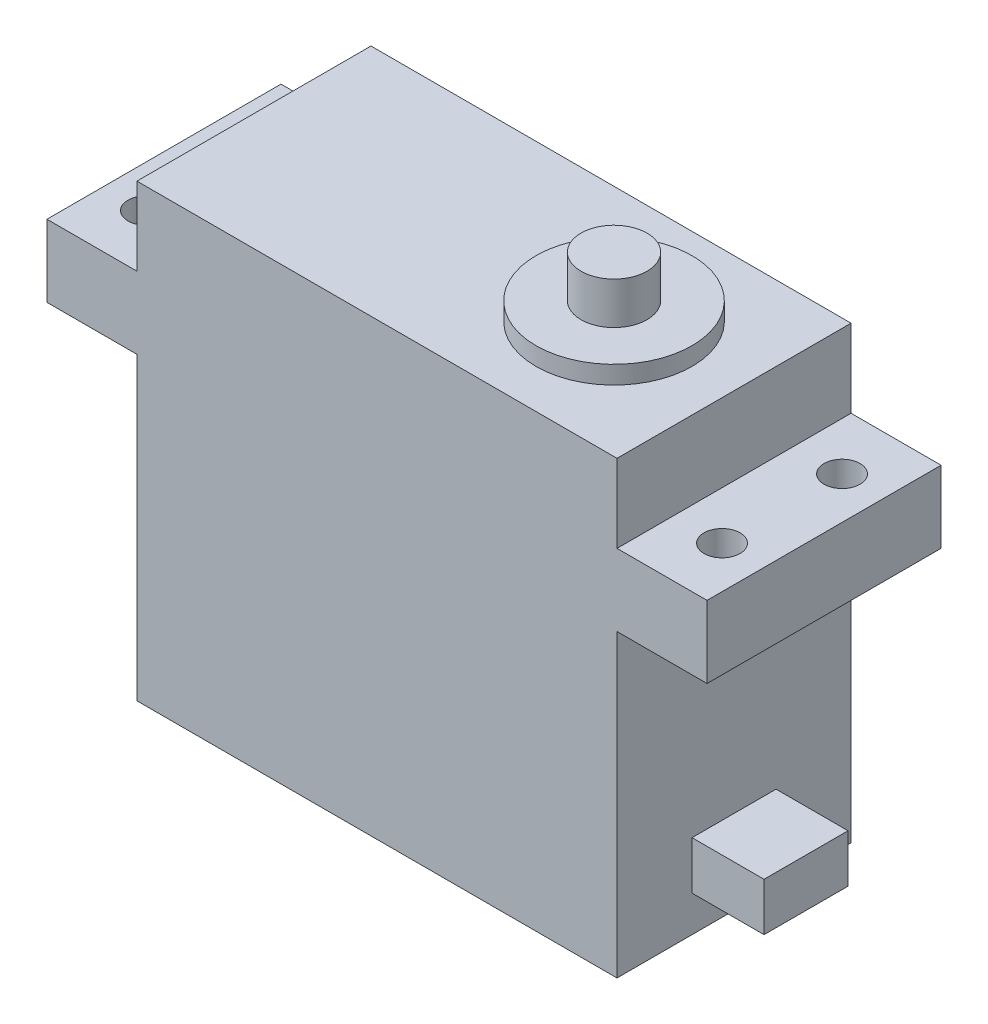
ISO-10303-21;
HEADER;
FILE_DESCRIPTION(('STEP AP214'),'2;1');
FILE_NAME('part.step','',(''),(''),'','','');
FILE_SCHEMA(('AUTOMOTIVE_DESIGN { 1 0 10303 214 1 1 1 1 }'));
ENDSEC;
DATA;
#1=APPLICATION_CONTEXT('core data for automotive mechanical design processes');
#2=APPLICATION_PROTOCOL_DEFINITION('international standard','automotive_design',2000,#1);
#3=PRODUCT_CONTEXT('',#1,'mechanical');
#4=PRODUCT('Part','Part','',(#3));
#5=PRODUCT_RELATED_PRODUCT_CATEGORY('part','',(#4));
#6=PRODUCT_DEFINITION_FORMATION('','',#4);
#7=PRODUCT_DEFINITION_CONTEXT('part definition',#1,'design');
#8=PRODUCT_DEFINITION('design','',#6,#7);
#9=PRODUCT_DEFINITION_SHAPE('','',#8);
#10=(LENGTH_UNIT() NAMED_UNIT(*) SI_UNIT(.MILLI.,.METRE.));
#11=(NAMED_UNIT(*) PLANE_ANGLE_UNIT() SI_UNIT($,.RADIAN.));
#12=(NAMED_UNIT(*) SI_UNIT($,.STERADIAN.) SOLID_ANGLE_UNIT());
#13=UNCERTAINTY_MEASURE_WITH_UNIT(LENGTH_MEASURE(1.E-05),#10,'distance_accuracy_value','');
#14=(GEOMETRIC_REPRESENTATION_CONTEXT(3) GLOBAL_UNCERTAINTY_ASSIGNED_CONTEXT((#13)) GLOBAL_UNIT_ASSIGNED_CONTEXT((#10,
#11,#12)) REPRESENTATION_CONTEXT('',''));
#15=CARTESIAN_POINT('',(0.,0.,0.));
#16=DIRECTION('',(0.,0.,1.));
#17=DIRECTION('',(1.,0.,0.));
#18=AXIS2_PLACEMENT_3D('',#15,#16,#17);
#19=CARTESIAN_POINT('',(10.,37.5,-9.75));
#20=DIRECTION('',(-1.,0.,0.));
#21=DIRECTION('',(0.,0.,1.));
#22=AXIS2_PLACEMENT_3D('',#19,#20,#21);
#23=PLANE('',#22);
#24=DIRECTION('',(0.,-1.,0.));
#25=VECTOR('',#24,1.);
#26=CARTESIAN_POINT('',(10.,37.5,-9.75));
#27=LINE('',#26,#25);
#28=CARTESIAN_POINT('',(10.,25.,-9.75));
#29=VERTEX_POINT('',#28);
#30=CARTESIAN_POINT('',(10.,0.,-9.75));
#31=VERTEX_POINT('',#30);
#32=EDGE_CURVE('E279',#29,#31,#27,.T.);
#33=ORIENTED_EDGE('',*,*,#32,.F.);
#34=DIRECTION('',(0.,0.,1.));
#35=VECTOR('',#34,1.);
#36=CARTESIAN_POINT('',(10.,25.,-9.75));
#37=LINE('',#36,#35);
#38=CARTESIAN_POINT('',(10.,25.,9.74999999999998));
#39=VERTEX_POINT('',#38);
#40=EDGE_CURVE('E232',#29,#39,#37,.T.);
#41=ORIENTED_EDGE('',*,*,#40,.T.);
#42=DIRECTION('',(0.,-1.,0.));
#43=VECTOR('',#42,1.);
#44=CARTESIAN_POINT('',(10.,37.5,9.75));
#45=LINE('',#44,#43);
#46=CARTESIAN_POINT('',(10.,0.,9.75));
#47=VERTEX_POINT('',#46);
#48=EDGE_CURVE('E282',#39,#47,#45,.T.);
#49=ORIENTED_EDGE('',*,*,#48,.T.);
#50=DIRECTION('',(0.,0.,-1.));
#51=VECTOR('',#50,1.);
#52=CARTESIAN_POINT('',(10.,0.,-9.75));
#53=LINE('',#52,#51);
#54=EDGE_CURVE('E272',#47,#31,#53,.T.);
#55=ORIENTED_EDGE('',*,*,#54,.T.);
#56=EDGE_LOOP('',(#33,#41,#49,#55));
#57=FACE_BOUND('',#56,.T.);
#58=DIRECTION('',(0.,-1.,0.));
#59=VECTOR('',#58,1.);
#60=CARTESIAN_POINT('',(10.,7.,3.5));
#61=LINE('',#60,#59);
#62=CARTESIAN_POINT('',(10.,7.,3.5));
#63=VERTEX_POINT('',#62);
#64=CARTESIAN_POINT('',(10.,3.00000000000001,3.5));
#65=VERTEX_POINT('',#64);
#66=EDGE_CURVE('E166',#63,#65,#61,.T.);
#67=ORIENTED_EDGE('',*,*,#66,.F.);
#68=DIRECTION('',(0.,0.,1.));
#69=VECTOR('',#68,1.);
#70=CARTESIAN_POINT('',(10.,7.,3.5));
#71=LINE('',#70,#69);
#72=CARTESIAN_POINT('',(10.,7.,-3.5));
#73=VERTEX_POINT('',#72);
#74=EDGE_CURVE('E163',#73,#63,#71,.T.);
#75=ORIENTED_EDGE('',*,*,#74,.F.);
#76=DIRECTION('',(0.,1.,0.));
#77=VECTOR('',#76,1.);
#78=CARTESIAN_POINT('',(10.,7.,-3.5));
#79=LINE('',#78,#77);
#80=CARTESIAN_POINT('',(10.,3.,-3.5));
#81=VERTEX_POINT('',#80);
#82=EDGE_CURVE('E53',#81,#73,#79,.T.);
#83=ORIENTED_EDGE('',*,*,#82,.F.);
#84=DIRECTION('',(0.,0.,-1.));
#85=VECTOR('',#84,1.);
#86=CARTESIAN_POINT('',(10.,3.,3.5));
#87=LINE('',#86,#85);
#88=EDGE_CURVE('E48',#65,#81,#87,.T.);
#89=ORIENTED_EDGE('',*,*,#88,.F.);
#90=EDGE_LOOP('',(#67,#75,#83,#89));
#91=FACE_BOUND('',#90,.T.);
#92=ADVANCED_FACE('F33',(#57,#91),#23,.F.);
#93=CARTESIAN_POINT('',(-30.,37.5,-9.75));
#94=DIRECTION('',(1.,0.,0.));
#95=DIRECTION('',(0.,0.,-1.));
#96=AXIS2_PLACEMENT_3D('',#93,#94,#95);
#97=PLANE('',#96);
#98=DIRECTION('',(0.,0.,-1.));
#99=VECTOR('',#98,1.);
#100=CARTESIAN_POINT('',(-30.,31.,-9.75));
#101=LINE('',#100,#99);
#102=CARTESIAN_POINT('',(-30.,31.,9.75));
#103=VERTEX_POINT('',#102);
#104=CARTESIAN_POINT('',(-30.,31.,-9.75));
#105=VERTEX_POINT('',#104);
#106=EDGE_CURVE('E240',#103,#105,#101,.T.);
#107=ORIENTED_EDGE('',*,*,#106,.F.);
#108=DIRECTION('',(0.,-1.,0.));
#109=VECTOR('',#108,1.);
#110=CARTESIAN_POINT('',(-30.,37.5,9.75));
#111=LINE('',#110,#109);
#112=CARTESIAN_POINT('',(-30.,37.5,9.75));
#113=VERTEX_POINT('',#112);
#114=EDGE_CURVE('E11',#113,#103,#111,.T.);
#115=ORIENTED_EDGE('',*,*,#114,.F.);
#116=DIRECTION('',(0.,0.,1.));
#117=VECTOR('',#116,1.);
#118=CARTESIAN_POINT('',(-30.,37.5,-9.75));
#119=LINE('',#118,#117);
#120=CARTESIAN_POINT('',(-30.,37.5,-9.75));
#121=VERTEX_POINT('',#120);
#122=EDGE_CURVE('E256',#121,#113,#119,.T.);
#123=ORIENTED_EDGE('',*,*,#122,.F.);
#124=DIRECTION('',(0.,-1.,0.));
#125=VECTOR('',#124,1.);
#126=CARTESIAN_POINT('',(-30.,37.5,-9.75));
#127=LINE('',#126,#125);
#128=EDGE_CURVE('E277',#121,#105,#127,.T.);
#129=ORIENTED_EDGE('',*,*,#128,.T.);
#130=EDGE_LOOP('',(#107,#115,#123,#129));
#131=FACE_BOUND('',#130,.T.);
#132=ADVANCED_FACE('F326',(#131),#97,.F.);
#133=DIRECTION('',(0.,0.,1.));
#134=VECTOR('',#133,1.);
#135=CARTESIAN_POINT('',(10.,31.,-9.75));
#136=LINE('',#135,#134);
#137=CARTESIAN_POINT('',(10.,31.,-9.75000000000002));
#138=VERTEX_POINT('',#137);
#139=CARTESIAN_POINT('',(10.,31.,9.74999999999998));
#140=VERTEX_POINT('',#139);
#141=EDGE_CURVE('E238',#138,#140,#136,.T.);
#142=ORIENTED_EDGE('',*,*,#141,.F.);
#143=CARTESIAN_POINT('',(10.,37.5,-9.75));
#144=VERTEX_POINT('',#143);
#145=EDGE_CURVE('E280',#144,#138,#27,.T.);
#146=ORIENTED_EDGE('',*,*,#145,.F.);
#147=DIRECTION('',(0.,0.,-1.));
#148=VECTOR('',#147,1.);
#149=CARTESIAN_POINT('',(10.,37.5,-9.75));
#150=LINE('',#149,#148);
#151=CARTESIAN_POINT('',(10.,37.5,9.75));
#152=VERTEX_POINT('',#151);
#153=EDGE_CURVE('E262',#152,#144,#150,.T.);
#154=ORIENTED_EDGE('',*,*,#153,.F.);
#155=EDGE_CURVE('E283',#152,#140,#45,.T.);
#156=ORIENTED_EDGE('',*,*,#155,.T.);
#157=EDGE_LOOP('',(#142,#146,#154,#156));
#158=FACE_BOUND('',#157,.T.);
#159=ADVANCED_FACE('F317',(#158),#23,.F.);
#160=CARTESIAN_POINT('',(0.,39.,0.));
#161=DIRECTION('',(0.,1.,0.));
#162=DIRECTION('',(0.,0.,1.));
#163=AXIS2_PLACEMENT_3D('',#160,#161,#162);
#164=PLANE('',#163);
#165=CARTESIAN_POINT('',(0.,39.,0.));
#166=DIRECTION('',(0.,1.,0.));
#167=DIRECTION('',(0.,0.,1.));
#168=AXIS2_PLACEMENT_3D('',#165,#166,#167);
#169=CIRCLE('',#168,6.5);
#170=CARTESIAN_POINT('',(0.,39.,6.5));
#171=VERTEX_POINT('',#170);
#172=EDGE_CURVE('E250',#171,#171,#169,.T.);
#173=ORIENTED_EDGE('',*,*,#172,.T.);
#174=EDGE_LOOP('',(#173));
#175=FACE_BOUND('',#174,.T.);
#176=CARTESIAN_POINT('',(0.,39.,0.));
#177=DIRECTION('',(0.,1.,0.));
#178=DIRECTION('',(0.,0.,1.));
#179=AXIS2_PLACEMENT_3D('',#176,#177,#178);
#180=CIRCLE('',#179,2.75);
#181=CARTESIAN_POINT('',(0.,39.,2.75));
#182=VERTEX_POINT('',#181);
#183=EDGE_CURVE('E243',#182,#182,#180,.T.);
#184=ORIENTED_EDGE('',*,*,#183,.F.);
#185=EDGE_LOOP('',(#184));
#186=FACE_BOUND('',#185,.T.);
#187=ADVANCED_FACE('F346',(#175,#186),#164,.T.);
#188=CARTESIAN_POINT('',(0.,37.5,0.));
#189=DIRECTION('',(0.,1.,0.));
#190=DIRECTION('',(0.,0.,1.));
#191=AXIS2_PLACEMENT_3D('',#188,#189,#190);
#192=PLANE('',#191);
#193=ORIENTED_EDGE('',*,*,#122,.T.);
#194=DIRECTION('',(1.,0.,0.));
#195=VECTOR('',#194,1.);
#196=CARTESIAN_POINT('',(-30.,37.5,9.75));
#197=LINE('',#196,#195);
#198=EDGE_CURVE('E259',#113,#152,#197,.T.);
#199=ORIENTED_EDGE('',*,*,#198,.T.);
#200=ORIENTED_EDGE('',*,*,#153,.T.);
#201=DIRECTION('',(-1.,0.,0.));
#202=VECTOR('',#201,1.);
#203=CARTESIAN_POINT('',(-30.,37.5,-9.75));
#204=LINE('',#203,#202);
#205=EDGE_CURVE('E264',#144,#121,#204,.T.);
#206=ORIENTED_EDGE('',*,*,#205,.T.);
#207=EDGE_LOOP('',(#193,#199,#200,#206));
#208=FACE_BOUND('',#207,.T.);
#209=CARTESIAN_POINT('',(0.,37.5,0.));
#210=DIRECTION('',(0.,1.,0.));
#211=DIRECTION('',(0.,0.,1.));
#212=AXIS2_PLACEMENT_3D('',#209,#210,#211);
#213=CIRCLE('',#212,6.5);
#214=CARTESIAN_POINT('',(0.,37.5,6.5));
#215=VERTEX_POINT('',#214);
#216=EDGE_CURVE('E247',#215,#215,#213,.T.);
#217=ORIENTED_EDGE('',*,*,#216,.F.);
#218=EDGE_LOOP('',(#217));
#219=FACE_BOUND('',#218,.T.);
#220=ADVANCED_FACE('F320',(#208,#219),#192,.T.);
#221=CARTESIAN_POINT('',(-30.,25.,9.75));
#222=VERTEX_POINT('',#221);
#223=CARTESIAN_POINT('',(-30.,0.,9.75));
#224=VERTEX_POINT('',#223);
#225=EDGE_CURVE('E41',#222,#224,#111,.T.);
#226=ORIENTED_EDGE('',*,*,#225,.F.);
#227=DIRECTION('',(0.,0.,-1.));
#228=VECTOR('',#227,1.);
#229=CARTESIAN_POINT('',(-30.,25.,-9.75));
#230=LINE('',#229,#228);
#231=CARTESIAN_POINT('',(-30.,25.,-9.75));
#232=VERTEX_POINT('',#231);
#233=EDGE_CURVE('E235',#222,#232,#230,.T.);
#234=ORIENTED_EDGE('',*,*,#233,.T.);
#235=CARTESIAN_POINT('',(-30.,0.,-9.75));
#236=VERTEX_POINT('',#235);
#237=EDGE_CURVE('E266',#232,#236,#127,.T.);
#238=ORIENTED_EDGE('',*,*,#237,.T.);
#239=DIRECTION('',(0.,0.,1.));
#240=VECTOR('',#239,1.);
#241=CARTESIAN_POINT('',(-30.,0.,-9.75));
#242=LINE('',#241,#240);
#243=EDGE_CURVE('E253',#236,#224,#242,.T.);
#244=ORIENTED_EDGE('',*,*,#243,.T.);
#245=EDGE_LOOP('',(#226,#234,#238,#244));
#246=FACE_BOUND('',#245,.T.);
#247=ADVANCED_FACE('F35',(#246),#97,.F.);
#248=CARTESIAN_POINT('',(-30.,37.5,9.75));
#249=DIRECTION('',(0.,0.,-1.));
#250=DIRECTION('',(-1.,0.,0.));
#251=AXIS2_PLACEMENT_3D('',#248,#249,#250);
#252=PLANE('',#251);
#253=ORIENTED_EDGE('',*,*,#48,.F.);
#254=DIRECTION('',(1.,0.,0.));
#255=VECTOR('',#254,1.);
#256=CARTESIAN_POINT('',(-37.5,25.,9.75));
#257=LINE('',#256,#255);
#258=CARTESIAN_POINT('',(17.5,25.,9.74999999999998));
#259=VERTEX_POINT('',#258);
#260=EDGE_CURVE('E213',#39,#259,#257,.T.);
#261=ORIENTED_EDGE('',*,*,#260,.T.);
#262=DIRECTION('',(0.,-1.,0.));
#263=VECTOR('',#262,1.);
#264=CARTESIAN_POINT('',(17.5,31.,9.74999999999998));
#265=LINE('',#264,#263);
#266=CARTESIAN_POINT('',(17.5,31.,9.74999999999998));
#267=VERTEX_POINT('',#266);
#268=EDGE_CURVE('E226',#267,#259,#265,.T.);
#269=ORIENTED_EDGE('',*,*,#268,.F.);
#270=DIRECTION('',(1.,0.,0.));
#271=VECTOR('',#270,1.);
#272=CARTESIAN_POINT('',(-37.5,31.,9.75));
#273=LINE('',#272,#271);
#274=EDGE_CURVE('E200',#140,#267,#273,.T.);
#275=ORIENTED_EDGE('',*,*,#274,.F.);
#276=ORIENTED_EDGE('',*,*,#155,.F.);
#277=ORIENTED_EDGE('',*,*,#198,.F.);
#278=ORIENTED_EDGE('',*,*,#114,.T.);
#279=CARTESIAN_POINT('',(-37.5,31.,9.75));
#280=VERTEX_POINT('',#279);
#281=EDGE_CURVE('E202',#280,#103,#273,.T.);
#282=ORIENTED_EDGE('',*,*,#281,.F.);
#283=DIRECTION('',(0.,-1.,0.));
#284=VECTOR('',#283,1.);
#285=CARTESIAN_POINT('',(-37.5,31.,9.75));
#286=LINE('',#285,#284);
#287=CARTESIAN_POINT('',(-37.5,25.,9.75));
#288=VERTEX_POINT('',#287);
#289=EDGE_CURVE('E229',#280,#288,#286,.T.);
#290=ORIENTED_EDGE('',*,*,#289,.T.);
#291=EDGE_CURVE('E214',#288,#222,#257,.T.);
#292=ORIENTED_EDGE('',*,*,#291,.T.);
#293=ORIENTED_EDGE('',*,*,#225,.T.);
#294=DIRECTION('',(1.,0.,0.));
#295=VECTOR('',#294,1.);
#296=CARTESIAN_POINT('',(-30.,0.,9.75));
#297=LINE('',#296,#295);
#298=EDGE_CURVE('E269',#224,#47,#297,.T.);
#299=ORIENTED_EDGE('',*,*,#298,.T.);
#300=EDGE_LOOP('',(#253,#261,#269,#275,#276,#277,#278,#282,#290,#292,#293,#299));
#301=FACE_BOUND('',#300,.T.);
#302=ADVANCED_FACE('F297',(#301),#252,.F.);
#303=CARTESIAN_POINT('',(-30.,37.5,-9.75));
#304=DIRECTION('',(0.,0.,1.));
#305=DIRECTION('',(1.,0.,0.));
#306=AXIS2_PLACEMENT_3D('',#303,#304,#305);
#307=PLANE('',#306);
#308=ORIENTED_EDGE('',*,*,#237,.F.);
#309=DIRECTION('',(-1.,0.,0.));
#310=VECTOR('',#309,1.);
#311=CARTESIAN_POINT('',(-37.5,25.,-9.75));
#312=LINE('',#311,#310);
#313=CARTESIAN_POINT('',(-37.5,25.,-9.75));
#314=VERTEX_POINT('',#313);
#315=EDGE_CURVE('E219',#232,#314,#312,.T.);
#316=ORIENTED_EDGE('',*,*,#315,.T.);
#317=DIRECTION('',(0.,-1.,0.));
#318=VECTOR('',#317,1.);
#319=CARTESIAN_POINT('',(-37.5,31.,-9.75));
#320=LINE('',#319,#318);
#321=CARTESIAN_POINT('',(-37.5,31.,-9.75));
#322=VERTEX_POINT('',#321);
#323=EDGE_CURVE('E210',#322,#314,#320,.T.);
#324=ORIENTED_EDGE('',*,*,#323,.F.);
#325=DIRECTION('',(-1.,0.,0.));
#326=VECTOR('',#325,1.);
#327=CARTESIAN_POINT('',(-37.5,31.,-9.75));
#328=LINE('',#327,#326);
#329=EDGE_CURVE('E207',#105,#322,#328,.T.);
#330=ORIENTED_EDGE('',*,*,#329,.F.);
#331=ORIENTED_EDGE('',*,*,#128,.F.);
#332=ORIENTED_EDGE('',*,*,#205,.F.);
#333=ORIENTED_EDGE('',*,*,#145,.T.);
#334=CARTESIAN_POINT('',(17.5,31.,-9.75000000000002));
#335=VERTEX_POINT('',#334);
#336=EDGE_CURVE('E208',#335,#138,#328,.T.);
#337=ORIENTED_EDGE('',*,*,#336,.F.);
#338=DIRECTION('',(0.,-1.,0.));
#339=VECTOR('',#338,1.);
#340=CARTESIAN_POINT('',(17.5,31.,-9.75000000000002));
#341=LINE('',#340,#339);
#342=CARTESIAN_POINT('',(17.5,25.,-9.75000000000002));
#343=VERTEX_POINT('',#342);
#344=EDGE_CURVE('E223',#335,#343,#341,.T.);
#345=ORIENTED_EDGE('',*,*,#344,.T.);
#346=EDGE_CURVE('E201',#343,#29,#312,.T.);
#347=ORIENTED_EDGE('',*,*,#346,.T.);
#348=ORIENTED_EDGE('',*,*,#32,.T.);
#349=DIRECTION('',(-1.,0.,0.));
#350=VECTOR('',#349,1.);
#351=CARTESIAN_POINT('',(-30.,0.,-9.75));
#352=LINE('',#351,#350);
#353=EDGE_CURVE('E260',#31,#236,#352,.T.);
#354=ORIENTED_EDGE('',*,*,#353,.T.);
#355=EDGE_LOOP('',(#308,#316,#324,#330,#331,#332,#333,#337,#345,#347,#348,#354));
#356=FACE_BOUND('',#355,.T.);
#357=ADVANCED_FACE('F302',(#356),#307,.F.);
#358=CARTESIAN_POINT('',(0.,0.,0.));
#359=DIRECTION('',(0.,1.,0.));
#360=DIRECTION('',(0.,0.,1.));
#361=AXIS2_PLACEMENT_3D('',#358,#359,#360);
#362=PLANE('',#361);
#363=ORIENTED_EDGE('',*,*,#243,.F.);
#364=ORIENTED_EDGE('',*,*,#353,.F.);
#365=ORIENTED_EDGE('',*,*,#54,.F.);
#366=ORIENTED_EDGE('',*,*,#298,.F.);
#367=EDGE_LOOP('',(#363,#364,#365,#366));
#368=FACE_BOUND('',#367,.T.);
#369=ADVANCED_FACE('F300',(#368),#362,.F.);
#370=CARTESIAN_POINT('',(0.,39.,0.));
#371=DIRECTION('',(0.,-1.,0.));
#372=DIRECTION('',(0.,0.,-1.));
#373=AXIS2_PLACEMENT_3D('',#370,#371,#372);
#374=CYLINDRICAL_SURFACE('',#373,6.5);
#375=ORIENTED_EDGE('',*,*,#172,.F.);
#376=EDGE_LOOP('',(#375));
#377=FACE_BOUND('',#376,.T.);
#378=ORIENTED_EDGE('',*,*,#216,.T.);
#379=EDGE_LOOP('',(#378));
#380=FACE_BOUND('',#379,.T.);
#381=ADVANCED_FACE('F367',(#377,#380),#374,.T.);
#382=CARTESIAN_POINT('',(0.,42.5,0.));
#383=DIRECTION('',(0.,-1.,0.));
#384=DIRECTION('',(0.,0.,-1.));
#385=AXIS2_PLACEMENT_3D('',#382,#383,#384);
#386=CYLINDRICAL_SURFACE('',#385,2.75);
#387=CARTESIAN_POINT('',(0.,42.5,0.));
#388=DIRECTION('',(0.,1.,0.));
#389=DIRECTION('',(0.,0.,1.));
#390=AXIS2_PLACEMENT_3D('',#387,#388,#389);
#391=CIRCLE('',#390,2.75);
#392=CARTESIAN_POINT('',(0.,42.5,2.75));
#393=VERTEX_POINT('',#392);
#394=EDGE_CURVE('E244',#393,#393,#391,.T.);
#395=ORIENTED_EDGE('',*,*,#394,.F.);
#396=EDGE_LOOP('',(#395));
#397=FACE_BOUND('',#396,.T.);
#398=ORIENTED_EDGE('',*,*,#183,.T.);
#399=EDGE_LOOP('',(#398));
#400=FACE_BOUND('',#399,.T.);
#401=ADVANCED_FACE('F365',(#397,#400),#386,.T.);
#402=CARTESIAN_POINT('',(0.,42.5,0.));
#403=DIRECTION('',(0.,1.,0.));
#404=DIRECTION('',(0.,0.,1.));
#405=AXIS2_PLACEMENT_3D('',#402,#403,#404);
#406=PLANE('',#405);
#407=ORIENTED_EDGE('',*,*,#394,.T.);
#408=EDGE_LOOP('',(#407));
#409=FACE_BOUND('',#408,.T.);
#410=ADVANCED_FACE('F393',(#409),#406,.T.);
#411=CARTESIAN_POINT('',(14.,31.,5.));
#412=DIRECTION('',(0.,-1.,0.));
#413=DIRECTION('',(0.,0.,-1.));
#414=AXIS2_PLACEMENT_3D('',#411,#412,#413);
#415=CYLINDRICAL_SURFACE('',#414,1.5);
#416=CARTESIAN_POINT('',(14.,31.,5.));
#417=DIRECTION('',(0.,1.,0.));
#418=DIRECTION('',(0.,0.,1.));
#419=AXIS2_PLACEMENT_3D('',#416,#417,#418);
#420=CIRCLE('',#419,1.5);
#421=CARTESIAN_POINT('',(14.,31.,6.5));
#422=VERTEX_POINT('',#421);
#423=EDGE_CURVE('E179',#422,#422,#420,.T.);
#424=ORIENTED_EDGE('',*,*,#423,.T.);
#425=EDGE_LOOP('',(#424));
#426=FACE_BOUND('',#425,.T.);
#427=CARTESIAN_POINT('',(14.,25.,5.));
#428=DIRECTION('',(0.,1.,0.));
#429=DIRECTION('',(0.,0.,1.));
#430=AXIS2_PLACEMENT_3D('',#427,#428,#429);
#431=CIRCLE('',#430,1.5);
#432=CARTESIAN_POINT('',(14.,25.,6.5));
#433=VERTEX_POINT('',#432);
#434=EDGE_CURVE('E177',#433,#433,#431,.T.);
#435=ORIENTED_EDGE('',*,*,#434,.F.);
#436=EDGE_LOOP('',(#435));
#437=FACE_BOUND('',#436,.T.);
#438=ADVANCED_FACE('F400',(#426,#437),#415,.F.);
#439=CARTESIAN_POINT('',(14.,31.,-5.));
#440=DIRECTION('',(0.,-1.,0.));
#441=DIRECTION('',(0.,0.,-1.));
#442=AXIS2_PLACEMENT_3D('',#439,#440,#441);
#443=CYLINDRICAL_SURFACE('',#442,1.5);
#444=CARTESIAN_POINT('',(14.,31.,-5.));
#445=DIRECTION('',(0.,1.,0.));
#446=DIRECTION('',(0.,0.,-1.));
#447=AXIS2_PLACEMENT_3D('',#444,#445,#446);
#448=CIRCLE('',#447,1.5);
#449=CARTESIAN_POINT('',(14.,31.,-6.5));
#450=VERTEX_POINT('',#449);
#451=EDGE_CURVE('E170',#450,#450,#448,.T.);
#452=ORIENTED_EDGE('',*,*,#451,.T.);
#453=EDGE_LOOP('',(#452));
#454=FACE_BOUND('',#453,.T.);
#455=CARTESIAN_POINT('',(14.,25.,-5.));
#456=DIRECTION('',(0.,1.,0.));
#457=DIRECTION('',(0.,0.,-1.));
#458=AXIS2_PLACEMENT_3D('',#455,#456,#457);
#459=CIRCLE('',#458,1.5);
#460=CARTESIAN_POINT('',(14.,25.,-6.5));
#461=VERTEX_POINT('',#460);
#462=EDGE_CURVE('E167',#461,#461,#459,.T.);
#463=ORIENTED_EDGE('',*,*,#462,.F.);
#464=EDGE_LOOP('',(#463));
#465=FACE_BOUND('',#464,.T.);
#466=ADVANCED_FACE('F407',(#454,#465),#443,.F.);
#467=CARTESIAN_POINT('',(17.5,31.,9.74999999999998));
#468=DIRECTION('',(-1.,0.,0.));
#469=DIRECTION('',(0.,0.,1.));
#470=AXIS2_PLACEMENT_3D('',#467,#468,#469);
#471=PLANE('',#470);
#472=DIRECTION('',(0.,0.,-1.));
#473=VECTOR('',#472,1.);
#474=CARTESIAN_POINT('',(17.5,25.,9.74999999999998));
#475=LINE('',#474,#473);
#476=EDGE_CURVE('E217',#259,#343,#475,.T.);
#477=ORIENTED_EDGE('',*,*,#476,.T.);
#478=ORIENTED_EDGE('',*,*,#344,.F.);
#479=DIRECTION('',(0.,0.,-1.));
#480=VECTOR('',#479,1.);
#481=CARTESIAN_POINT('',(17.5,31.,9.74999999999998));
#482=LINE('',#481,#480);
#483=EDGE_CURVE('E205',#267,#335,#482,.T.);
#484=ORIENTED_EDGE('',*,*,#483,.F.);
#485=ORIENTED_EDGE('',*,*,#268,.T.);
#486=EDGE_LOOP('',(#477,#478,#484,#485));
#487=FACE_BOUND('',#486,.T.);
#488=ADVANCED_FACE('F313',(#487),#471,.F.);
#489=CARTESIAN_POINT('',(0.,25.,0.));
#490=DIRECTION('',(0.,-1.,0.));
#491=DIRECTION('',(0.,0.,-1.));
#492=AXIS2_PLACEMENT_3D('',#489,#490,#491);
#493=PLANE('',#492);
#494=ORIENTED_EDGE('',*,*,#462,.T.);
#495=EDGE_LOOP('',(#494));
#496=FACE_BOUND('',#495,.T.);
#497=ORIENTED_EDGE('',*,*,#434,.T.);
#498=EDGE_LOOP('',(#497));
#499=FACE_BOUND('',#498,.T.);
#500=ORIENTED_EDGE('',*,*,#40,.F.);
#501=ORIENTED_EDGE('',*,*,#346,.F.);
#502=ORIENTED_EDGE('',*,*,#476,.F.);
#503=ORIENTED_EDGE('',*,*,#260,.F.);
#504=EDGE_LOOP('',(#500,#501,#502,#503));
#505=FACE_BOUND('',#504,.T.);
#506=ADVANCED_FACE('F308',(#496,#499,#505),#493,.T.);
#507=CARTESIAN_POINT('',(0.,31.,0.));
#508=DIRECTION('',(0.,-1.,0.));
#509=DIRECTION('',(0.,0.,-1.));
#510=AXIS2_PLACEMENT_3D('',#507,#508,#509);
#511=PLANE('',#510);
#512=ORIENTED_EDGE('',*,*,#451,.F.);
#513=EDGE_LOOP('',(#512));
#514=FACE_BOUND('',#513,.T.);
#515=ORIENTED_EDGE('',*,*,#423,.F.);
#516=EDGE_LOOP('',(#515));
#517=FACE_BOUND('',#516,.T.);
#518=ORIENTED_EDGE('',*,*,#336,.T.);
#519=ORIENTED_EDGE('',*,*,#141,.T.);
#520=ORIENTED_EDGE('',*,*,#274,.T.);
#521=ORIENTED_EDGE('',*,*,#483,.T.);
#522=EDGE_LOOP('',(#518,#519,#520,#521));
#523=FACE_BOUND('',#522,.T.);
#524=ADVANCED_FACE('F315',(#514,#517,#523),#511,.F.);
#525=CARTESIAN_POINT('',(-34.,31.,5.));
#526=DIRECTION('',(0.,1.,0.));
#527=DIRECTION('',(0.,0.,-1.));
#528=AXIS2_PLACEMENT_3D('',#525,#526,#527);
#529=CIRCLE('',#528,1.5);
#530=CARTESIAN_POINT('',(-34.,31.,3.5));
#531=VERTEX_POINT('',#530);
#532=EDGE_CURVE('E185',#531,#531,#529,.T.);
#533=ORIENTED_EDGE('',*,*,#532,.F.);
#534=EDGE_LOOP('',(#533));
#535=FACE_BOUND('',#534,.T.);
#536=CARTESIAN_POINT('',(-34.,31.,-5.));
#537=DIRECTION('',(0.,1.,0.));
#538=DIRECTION('',(0.,0.,1.));
#539=AXIS2_PLACEMENT_3D('',#536,#537,#538);
#540=CIRCLE('',#539,1.5);
#541=CARTESIAN_POINT('',(-34.,31.,-3.5));
#542=VERTEX_POINT('',#541);
#543=EDGE_CURVE('E191',#542,#542,#540,.T.);
#544=ORIENTED_EDGE('',*,*,#543,.F.);
#545=EDGE_LOOP('',(#544));
#546=FACE_BOUND('',#545,.T.);
#547=ORIENTED_EDGE('',*,*,#281,.T.);
#548=ORIENTED_EDGE('',*,*,#106,.T.);
#549=ORIENTED_EDGE('',*,*,#329,.T.);
#550=DIRECTION('',(0.,0.,1.));
#551=VECTOR('',#550,1.);
#552=CARTESIAN_POINT('',(-37.5,31.,9.75));
#553=LINE('',#552,#551);
#554=EDGE_CURVE('E197',#322,#280,#553,.T.);
#555=ORIENTED_EDGE('',*,*,#554,.T.);
#556=EDGE_LOOP('',(#547,#548,#549,#555));
#557=FACE_BOUND('',#556,.T.);
#558=ADVANCED_FACE('F328',(#535,#546,#557),#511,.F.);
#559=CARTESIAN_POINT('',(-34.,25.,5.));
#560=DIRECTION('',(0.,1.,0.));
#561=DIRECTION('',(0.,0.,-1.));
#562=AXIS2_PLACEMENT_3D('',#559,#560,#561);
#563=CIRCLE('',#562,1.5);
#564=CARTESIAN_POINT('',(-34.,25.,3.5));
#565=VERTEX_POINT('',#564);
#566=EDGE_CURVE('E182',#565,#565,#563,.T.);
#567=ORIENTED_EDGE('',*,*,#566,.T.);
#568=EDGE_LOOP('',(#567));
#569=FACE_BOUND('',#568,.T.);
#570=CARTESIAN_POINT('',(-34.,25.,-5.));
#571=DIRECTION('',(0.,1.,0.));
#572=DIRECTION('',(0.,0.,1.));
#573=AXIS2_PLACEMENT_3D('',#570,#571,#572);
#574=CIRCLE('',#573,1.5);
#575=CARTESIAN_POINT('',(-34.,25.,-3.5));
#576=VERTEX_POINT('',#575);
#577=EDGE_CURVE('E188',#576,#576,#574,.T.);
#578=ORIENTED_EDGE('',*,*,#577,.T.);
#579=EDGE_LOOP('',(#578));
#580=FACE_BOUND('',#579,.T.);
#581=ORIENTED_EDGE('',*,*,#233,.F.);
#582=ORIENTED_EDGE('',*,*,#291,.F.);
#583=DIRECTION('',(0.,0.,1.));
#584=VECTOR('',#583,1.);
#585=CARTESIAN_POINT('',(-37.5,25.,9.75));
#586=LINE('',#585,#584);
#587=EDGE_CURVE('E194',#314,#288,#586,.T.);
#588=ORIENTED_EDGE('',*,*,#587,.F.);
#589=ORIENTED_EDGE('',*,*,#315,.F.);
#590=EDGE_LOOP('',(#581,#582,#588,#589));
#591=FACE_BOUND('',#590,.T.);
#592=ADVANCED_FACE('F338',(#569,#580,#591),#493,.T.);
#593=CARTESIAN_POINT('',(-37.5,31.,9.75));
#594=DIRECTION('',(1.,0.,0.));
#595=DIRECTION('',(0.,0.,-1.));
#596=AXIS2_PLACEMENT_3D('',#593,#594,#595);
#597=PLANE('',#596);
#598=ORIENTED_EDGE('',*,*,#587,.T.);
#599=ORIENTED_EDGE('',*,*,#289,.F.);
#600=ORIENTED_EDGE('',*,*,#554,.F.);
#601=ORIENTED_EDGE('',*,*,#323,.T.);
#602=EDGE_LOOP('',(#598,#599,#600,#601));
#603=FACE_BOUND('',#602,.T.);
#604=ADVANCED_FACE('F334',(#603),#597,.F.);
#605=CARTESIAN_POINT('',(-34.,31.,-5.));
#606=DIRECTION('',(0.,-1.,0.));
#607=DIRECTION('',(0.,0.,-1.));
#608=AXIS2_PLACEMENT_3D('',#605,#606,#607);
#609=CYLINDRICAL_SURFACE('',#608,1.5);
#610=ORIENTED_EDGE('',*,*,#543,.T.);
#611=EDGE_LOOP('',(#610));
#612=FACE_BOUND('',#611,.T.);
#613=ORIENTED_EDGE('',*,*,#577,.F.);
#614=EDGE_LOOP('',(#613));
#615=FACE_BOUND('',#614,.T.);
#616=ADVANCED_FACE('F454',(#612,#615),#609,.F.);
#617=CARTESIAN_POINT('',(-34.,31.,5.));
#618=DIRECTION('',(0.,-1.,0.));
#619=DIRECTION('',(0.,0.,-1.));
#620=AXIS2_PLACEMENT_3D('',#617,#618,#619);
#621=CYLINDRICAL_SURFACE('',#620,1.5);
#622=ORIENTED_EDGE('',*,*,#532,.T.);
#623=EDGE_LOOP('',(#622));
#624=FACE_BOUND('',#623,.T.);
#625=ORIENTED_EDGE('',*,*,#566,.F.);
#626=EDGE_LOOP('',(#625));
#627=FACE_BOUND('',#626,.T.);
#628=ADVANCED_FACE('F461',(#624,#627),#621,.F.);
#629=CARTESIAN_POINT('',(16.,7.,3.5));
#630=DIRECTION('',(0.,0.,-1.));
#631=DIRECTION('',(-1.,0.,0.));
#632=AXIS2_PLACEMENT_3D('',#629,#630,#631);
#633=PLANE('',#632);
#634=ORIENTED_EDGE('',*,*,#66,.T.);
#635=DIRECTION('',(-1.,0.,0.));
#636=VECTOR('',#635,1.);
#637=CARTESIAN_POINT('',(16.,3.,3.5));
#638=LINE('',#637,#636);
#639=CARTESIAN_POINT('',(16.,3.,3.5));
#640=VERTEX_POINT('',#639);
#641=EDGE_CURVE('E147',#640,#65,#638,.T.);
#642=ORIENTED_EDGE('',*,*,#641,.F.);
#643=DIRECTION('',(0.,-1.,0.));
#644=VECTOR('',#643,1.);
#645=CARTESIAN_POINT('',(16.,7.,3.5));
#646=LINE('',#645,#644);
#647=CARTESIAN_POINT('',(16.,7.,3.5));
#648=VERTEX_POINT('',#647);
#649=EDGE_CURVE('E154',#648,#640,#646,.T.);
#650=ORIENTED_EDGE('',*,*,#649,.F.);
#651=DIRECTION('',(-1.,0.,0.));
#652=VECTOR('',#651,1.);
#653=CARTESIAN_POINT('',(16.,7.,3.5));
#654=LINE('',#653,#652);
#655=EDGE_CURVE('E584',#648,#63,#654,.T.);
#656=ORIENTED_EDGE('',*,*,#655,.T.);
#657=EDGE_LOOP('',(#634,#642,#650,#656));
#658=FACE_BOUND('',#657,.T.);
#659=ADVANCED_FACE('F165',(#658),#633,.F.);
#660=CARTESIAN_POINT('',(16.,3.,3.5));
#661=DIRECTION('',(0.,1.,0.));
#662=DIRECTION('',(0.,0.,1.));
#663=AXIS2_PLACEMENT_3D('',#660,#661,#662);
#664=PLANE('',#663);
#665=ORIENTED_EDGE('',*,*,#88,.T.);
#666=DIRECTION('',(-1.,0.,0.));
#667=VECTOR('',#666,1.);
#668=CARTESIAN_POINT('',(16.,3.,-3.5));
#669=LINE('',#668,#667);
#670=CARTESIAN_POINT('',(16.,3.,-3.5));
#671=VERTEX_POINT('',#670);
#672=EDGE_CURVE('E150',#671,#81,#669,.T.);
#673=ORIENTED_EDGE('',*,*,#672,.F.);
#674=DIRECTION('',(0.,0.,-1.));
#675=VECTOR('',#674,1.);
#676=CARTESIAN_POINT('',(16.,3.,3.5));
#677=LINE('',#676,#675);
#678=EDGE_CURVE('E143',#640,#671,#677,.T.);
#679=ORIENTED_EDGE('',*,*,#678,.F.);
#680=ORIENTED_EDGE('',*,*,#641,.T.);
#681=EDGE_LOOP('',(#665,#673,#679,#680));
#682=FACE_BOUND('',#681,.T.);
#683=ADVANCED_FACE('F145',(#682),#664,.F.);
#684=CARTESIAN_POINT('',(16.,7.,-3.5));
#685=DIRECTION('',(0.,0.,1.));
#686=DIRECTION('',(1.,0.,0.));
#687=AXIS2_PLACEMENT_3D('',#684,#685,#686);
#688=PLANE('',#687);
#689=ORIENTED_EDGE('',*,*,#82,.T.);
#690=DIRECTION('',(-1.,0.,0.));
#691=VECTOR('',#690,1.);
#692=CARTESIAN_POINT('',(16.,7.,-3.5));
#693=LINE('',#692,#691);
#694=CARTESIAN_POINT('',(16.,7.,-3.5));
#695=VERTEX_POINT('',#694);
#696=EDGE_CURVE('E172',#695,#73,#693,.T.);
#697=ORIENTED_EDGE('',*,*,#696,.F.);
#698=DIRECTION('',(0.,1.,0.));
#699=VECTOR('',#698,1.);
#700=CARTESIAN_POINT('',(16.,7.,-3.5));
#701=LINE('',#700,#699);
#702=EDGE_CURVE('E153',#671,#695,#701,.T.);
#703=ORIENTED_EDGE('',*,*,#702,.F.);
#704=ORIENTED_EDGE('',*,*,#672,.T.);
#705=EDGE_LOOP('',(#689,#697,#703,#704));
#706=FACE_BOUND('',#705,.T.);
#707=ADVANCED_FACE('F482',(#706),#688,.F.);
#708=CARTESIAN_POINT('',(16.,7.,3.5));
#709=DIRECTION('',(0.,-1.,0.));
#710=DIRECTION('',(0.,0.,-1.));
#711=AXIS2_PLACEMENT_3D('',#708,#709,#710);
#712=PLANE('',#711);
#713=ORIENTED_EDGE('',*,*,#74,.T.);
#714=ORIENTED_EDGE('',*,*,#655,.F.);
#715=DIRECTION('',(0.,0.,1.));
#716=VECTOR('',#715,1.);
#717=CARTESIAN_POINT('',(16.,7.,3.5));
#718=LINE('',#717,#716);
#719=EDGE_CURVE('E159',#695,#648,#718,.T.);
#720=ORIENTED_EDGE('',*,*,#719,.F.);
#721=ORIENTED_EDGE('',*,*,#696,.T.);
#722=EDGE_LOOP('',(#713,#714,#720,#721));
#723=FACE_BOUND('',#722,.T.);
#724=ADVANCED_FACE('F489',(#723),#712,.F.);
#725=CARTESIAN_POINT('',(16.,0.,0.));
#726=DIRECTION('',(1.,0.,0.));
#727=DIRECTION('',(0.,0.,-1.));
#728=AXIS2_PLACEMENT_3D('',#725,#726,#727);
#729=PLANE('',#728);
#730=ORIENTED_EDGE('',*,*,#649,.T.);
#731=ORIENTED_EDGE('',*,*,#678,.T.);
#732=ORIENTED_EDGE('',*,*,#702,.T.);
#733=ORIENTED_EDGE('',*,*,#719,.T.);
#734=EDGE_LOOP('',(#730,#731,#732,#733));
#735=FACE_BOUND('',#734,.T.);
#736=ADVANCED_FACE('F157',(#735),#729,.T.);
#737=CLOSED_SHELL('',(#92,#132,#159,#187,#220,#247,#302,#357,#369,#381,#401,#410,#438,#466,#488,
#506,#524,#558,#592,#604,#616,#628,#659,#683,#707,#724,#736));
#738=MANIFOLD_SOLID_BREP('B2',#737);
#739=ADVANCED_BREP_SHAPE_REPRESENTATION('',(#18,#738),#14);
#740=SHAPE_DEFINITION_REPRESENTATION(#9,#739);
ENDSEC;
END-ISO-10303-21;
